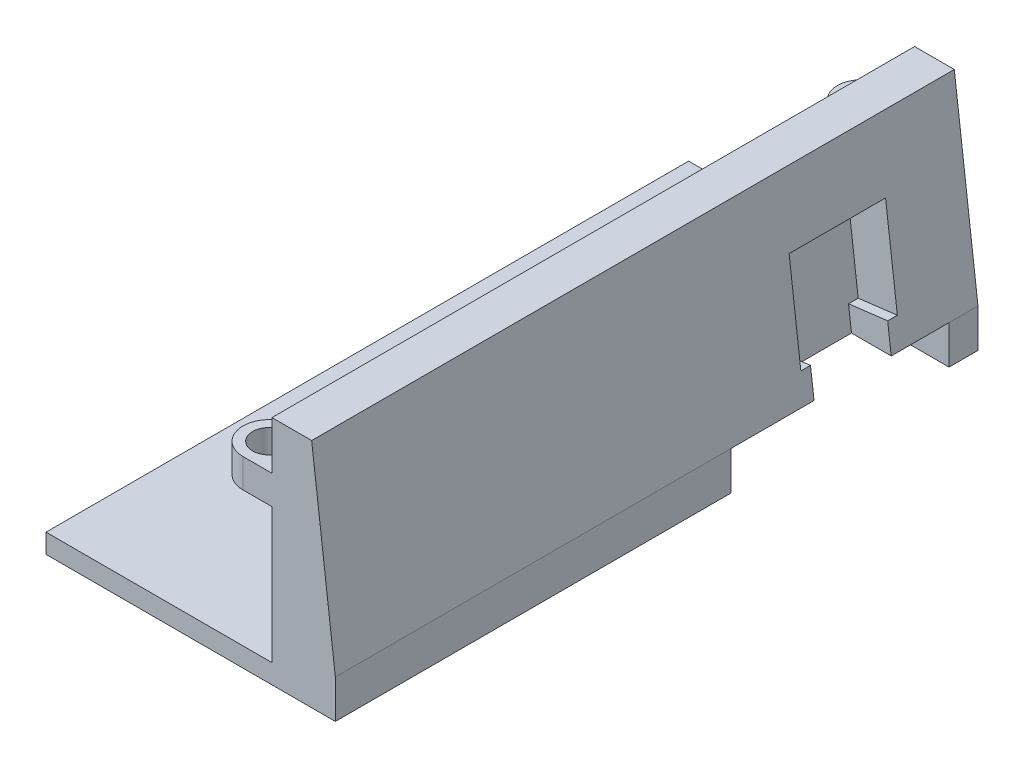
ISO-10303-21;
HEADER;
FILE_DESCRIPTION(('STEP AP214'),'2;1');
FILE_NAME('part.step','',(''),(''),'','','');
FILE_SCHEMA(('AUTOMOTIVE_DESIGN { 1 0 10303 214 1 1 1 1 }'));
ENDSEC;
DATA;
#1=APPLICATION_CONTEXT('core data for automotive mechanical design processes');
#2=APPLICATION_PROTOCOL_DEFINITION('international standard','automotive_design',2000,#1);
#3=PRODUCT_CONTEXT('',#1,'mechanical');
#4=PRODUCT('Part','Part','',(#3));
#5=PRODUCT_RELATED_PRODUCT_CATEGORY('part','',(#4));
#6=PRODUCT_DEFINITION_FORMATION('','',#4);
#7=PRODUCT_DEFINITION_CONTEXT('part definition',#1,'design');
#8=PRODUCT_DEFINITION('design','',#6,#7);
#9=PRODUCT_DEFINITION_SHAPE('','',#8);
#10=(LENGTH_UNIT() NAMED_UNIT(*) SI_UNIT(.MILLI.,.METRE.));
#11=(NAMED_UNIT(*) PLANE_ANGLE_UNIT() SI_UNIT($,.RADIAN.));
#12=(NAMED_UNIT(*) SI_UNIT($,.STERADIAN.) SOLID_ANGLE_UNIT());
#13=UNCERTAINTY_MEASURE_WITH_UNIT(LENGTH_MEASURE(1.E-05),#10,'distance_accuracy_value','');
#14=(GEOMETRIC_REPRESENTATION_CONTEXT(3) GLOBAL_UNCERTAINTY_ASSIGNED_CONTEXT((#13)) GLOBAL_UNIT_ASSIGNED_CONTEXT((#10,
#11,#12)) REPRESENTATION_CONTEXT('',''));
#15=CARTESIAN_POINT('',(0.,0.,0.));
#16=DIRECTION('',(0.,0.,1.));
#17=DIRECTION('',(1.,0.,0.));
#18=AXIS2_PLACEMENT_3D('',#15,#16,#17);
#19=CARTESIAN_POINT('',(0.,-12.,-2.5));
#20=DIRECTION('',(0.,1.,0.));
#21=DIRECTION('',(-1.,0.,0.));
#22=AXIS2_PLACEMENT_3D('',#19,#20,#21);
#23=PLANE('',#22);
#24=DIRECTION('',(-1.,0.,0.));
#25=VECTOR('',#24,1.);
#26=CARTESIAN_POINT('',(9.57405631451568,-12.,0.499999999999999));
#27=LINE('',#26,#25);
#28=CARTESIAN_POINT('',(9.57405631451568,-12.,0.499999999999999));
#29=VERTEX_POINT('',#28);
#30=CARTESIAN_POINT('',(3.00000000000001,-12.,0.499999999999999));
#31=VERTEX_POINT('',#30);
#32=EDGE_CURVE('E245',#29,#31,#27,.T.);
#33=ORIENTED_EDGE('',*,*,#32,.F.);
#34=DIRECTION('',(0.,0.,1.));
#35=VECTOR('',#34,1.);
#36=CARTESIAN_POINT('',(9.57405631451568,-12.,-2.5));
#37=LINE('',#36,#35);
#38=CARTESIAN_POINT('',(9.57405631451568,-12.,6.49999999999999));
#39=VERTEX_POINT('',#38);
#40=EDGE_CURVE('E412',#29,#39,#37,.T.);
#41=ORIENTED_EDGE('',*,*,#40,.T.);
#42=DIRECTION('',(-1.,0.,0.));
#43=VECTOR('',#42,1.);
#44=CARTESIAN_POINT('',(0.,-12.,6.49999999999999));
#45=LINE('',#44,#43);
#46=CARTESIAN_POINT('',(5.45569121805803,-12.,6.49999999999999));
#47=VERTEX_POINT('',#46);
#48=EDGE_CURVE('E393',#39,#47,#45,.T.);
#49=ORIENTED_EDGE('',*,*,#48,.T.);
#50=DIRECTION('',(0.,0.,-1.));
#51=VECTOR('',#50,1.);
#52=CARTESIAN_POINT('',(5.45569121805803,-12.,-2.5));
#53=LINE('',#52,#51);
#54=CARTESIAN_POINT('',(5.45569121805803,-12.,14.5));
#55=VERTEX_POINT('',#54);
#56=EDGE_CURVE('E11',#55,#47,#53,.T.);
#57=ORIENTED_EDGE('',*,*,#56,.F.);
#58=DIRECTION('',(-1.,0.,0.));
#59=VECTOR('',#58,1.);
#60=CARTESIAN_POINT('',(0.,-12.,14.5));
#61=LINE('',#60,#59);
#62=CARTESIAN_POINT('',(9.57405631451568,-12.,14.5));
#63=VERTEX_POINT('',#62);
#64=EDGE_CURVE('E397',#63,#55,#61,.T.);
#65=ORIENTED_EDGE('',*,*,#64,.F.);
#66=CARTESIAN_POINT('',(9.57405631451568,-12.,23.13));
#67=VERTEX_POINT('',#66);
#68=EDGE_CURVE('E404',#63,#67,#37,.T.);
#69=ORIENTED_EDGE('',*,*,#68,.T.);
#70=DIRECTION('',(1.,0.,0.));
#71=VECTOR('',#70,1.);
#72=CARTESIAN_POINT('',(9.57405631451568,-12.,23.13));
#73=LINE('',#72,#71);
#74=CARTESIAN_POINT('',(3.00000000000001,-12.,23.13));
#75=VERTEX_POINT('',#74);
#76=EDGE_CURVE('E333',#75,#67,#73,.T.);
#77=ORIENTED_EDGE('',*,*,#76,.F.);
#78=DIRECTION('',(0.,0.,1.));
#79=VECTOR('',#78,1.);
#80=CARTESIAN_POINT('',(3.00000000000001,-12.,-2.5));
#81=LINE('',#80,#79);
#82=EDGE_CURVE('E57',#31,#75,#81,.T.);
#83=ORIENTED_EDGE('',*,*,#82,.F.);
#84=EDGE_LOOP('',(#33,#41,#49,#57,#65,#69,#77,#83));
#85=FACE_BOUND('',#84,.T.);
#86=ADVANCED_FACE('F41',(#85),#23,.F.);
#87=CARTESIAN_POINT('',(7.98032974621002,0.979861283748758,-2.5));
#88=DIRECTION('',(-0.992546151641322,-0.121869343405144,0.));
#89=DIRECTION('',(0.121869343405144,-0.992546151641323,0.));
#90=AXIS2_PLACEMENT_3D('',#87,#88,#89);
#91=PLANE('',#90);
#92=DIRECTION('',(0.121869343405144,-0.992546151641323,0.));
#93=VECTOR('',#92,1.);
#94=CARTESIAN_POINT('',(7.98032974621002,0.979861283748758,14.5));
#95=LINE('',#94,#93);
#96=CARTESIAN_POINT('',(9.20844828430025,-9.02236154507603,14.5));
#97=VERTEX_POINT('',#96);
#98=EDGE_CURVE('E50',#97,#63,#95,.T.);
#99=ORIENTED_EDGE('',*,*,#98,.F.);
#100=DIRECTION('',(0.,0.,1.));
#101=VECTOR('',#100,1.);
#102=CARTESIAN_POINT('',(9.20844828430025,-9.02236154507603,-2.5));
#103=LINE('',#102,#101);
#104=CARTESIAN_POINT('',(9.20844828430025,-9.02236154507603,15.5));
#105=VERTEX_POINT('',#104);
#106=EDGE_CURVE('E548',#97,#105,#103,.T.);
#107=ORIENTED_EDGE('',*,*,#106,.T.);
#108=DIRECTION('',(0.121869343405144,-0.992546151641323,0.));
#109=VECTOR('',#108,1.);
#110=CARTESIAN_POINT('',(7.98032974621002,0.979861283748758,15.5));
#111=LINE('',#110,#109);
#112=CARTESIAN_POINT('',(7.98975485024881,0.903099971337193,15.5));
#113=VERTEX_POINT('',#112);
#114=EDGE_CURVE('E530',#113,#105,#111,.T.);
#115=ORIENTED_EDGE('',*,*,#114,.F.);
#116=DIRECTION('',(0.,0.,1.));
#117=VECTOR('',#116,1.);
#118=CARTESIAN_POINT('',(7.98975485024881,0.903099971337191,-2.5));
#119=LINE('',#118,#117);
#120=CARTESIAN_POINT('',(7.98975485024881,0.903099971337192,5.5));
#121=VERTEX_POINT('',#120);
#122=EDGE_CURVE('E533',#121,#113,#119,.T.);
#123=ORIENTED_EDGE('',*,*,#122,.F.);
#124=DIRECTION('',(0.121869343405144,-0.992546151641323,0.));
#125=VECTOR('',#124,1.);
#126=CARTESIAN_POINT('',(7.98032974621002,0.97986128374875,5.5));
#127=LINE('',#126,#125);
#128=CARTESIAN_POINT('',(9.20844828430025,-9.02236154507603,5.49999999999999));
#129=VERTEX_POINT('',#128);
#130=EDGE_CURVE('E536',#121,#129,#127,.T.);
#131=ORIENTED_EDGE('',*,*,#130,.T.);
#132=DIRECTION('',(0.,0.,1.));
#133=VECTOR('',#132,1.);
#134=CARTESIAN_POINT('',(9.20844828430025,-9.02236154507603,-2.5));
#135=LINE('',#134,#133);
#136=CARTESIAN_POINT('',(9.20844828430025,-9.02236154507603,6.49999999999999));
#137=VERTEX_POINT('',#136);
#138=EDGE_CURVE('E540',#129,#137,#135,.T.);
#139=ORIENTED_EDGE('',*,*,#138,.T.);
#140=DIRECTION('',(0.121869343405144,-0.992546151641323,0.));
#141=VECTOR('',#140,1.);
#142=CARTESIAN_POINT('',(7.98032974621002,0.979861283748757,6.49999999999999));
#143=LINE('',#142,#141);
#144=EDGE_CURVE('E544',#137,#39,#143,.T.);
#145=ORIENTED_EDGE('',*,*,#144,.T.);
#146=ORIENTED_EDGE('',*,*,#40,.F.);
#147=CARTESIAN_POINT('',(9.57405631451568,-12.,-2.5));
#148=VERTEX_POINT('',#147);
#149=EDGE_CURVE('E407',#148,#29,#37,.T.);
#150=ORIENTED_EDGE('',*,*,#149,.F.);
#151=DIRECTION('',(0.121869343405144,-0.992546151641322,0.));
#152=VECTOR('',#151,1.);
#153=CARTESIAN_POINT('',(7.98032974621002,0.979861283748758,-2.5));
#154=LINE('',#153,#152);
#155=CARTESIAN_POINT('',(7.11836509645766,8.,-2.5));
#156=VERTEX_POINT('',#155);
#157=EDGE_CURVE('E401',#156,#148,#154,.T.);
#158=ORIENTED_EDGE('',*,*,#157,.F.);
#159=DIRECTION('',(0.,0.,1.));
#160=VECTOR('',#159,1.);
#161=CARTESIAN_POINT('',(7.11836509645766,8.,-2.5));
#162=LINE('',#161,#160);
#163=CARTESIAN_POINT('',(7.11836509645766,8.,64.13));
#164=VERTEX_POINT('',#163);
#165=EDGE_CURVE('E430',#156,#164,#162,.T.);
#166=ORIENTED_EDGE('',*,*,#165,.T.);
#167=DIRECTION('',(0.121869343405144,-0.992546151641322,0.));
#168=VECTOR('',#167,1.);
#169=CARTESIAN_POINT('',(7.98032974621002,0.979861283748758,64.13));
#170=LINE('',#169,#168);
#171=CARTESIAN_POINT('',(9.57405631451568,-12.,64.13));
#172=VERTEX_POINT('',#171);
#173=EDGE_CURVE('E400',#164,#172,#170,.T.);
#174=ORIENTED_EDGE('',*,*,#173,.T.);
#175=DIRECTION('',(0.,0.,1.));
#176=VECTOR('',#175,1.);
#177=CARTESIAN_POINT('',(9.57405631451568,-12.,64.13));
#178=LINE('',#177,#176);
#179=EDGE_CURVE('E327',#67,#172,#178,.T.);
#180=ORIENTED_EDGE('',*,*,#179,.F.);
#181=ORIENTED_EDGE('',*,*,#68,.F.);
#182=EDGE_LOOP('',(#99,#107,#115,#123,#131,#139,#145,#146,#150,#158,#166,#174,#180,#181));
#183=FACE_BOUND('',#182,.T.);
#184=ADVANCED_FACE('F564',(#183),#91,.F.);
#185=CARTESIAN_POINT('',(0.,3.,58.63));
#186=DIRECTION('',(0.,0.,-1.));
#187=DIRECTION('',(-1.,0.,0.));
#188=AXIS2_PLACEMENT_3D('',#185,#186,#187);
#189=PLANE('',#188);
#190=DIRECTION('',(1.,0.,0.));
#191=VECTOR('',#190,1.);
#192=CARTESIAN_POINT('',(0.,3.,58.63));
#193=LINE('',#192,#191);
#194=CARTESIAN_POINT('',(0.,3.,58.63));
#195=VERTEX_POINT('',#194);
#196=CARTESIAN_POINT('',(3.00000000000001,3.,58.63));
#197=VERTEX_POINT('',#196);
#198=EDGE_CURVE('E459',#195,#197,#193,.T.);
#199=ORIENTED_EDGE('',*,*,#198,.T.);
#200=DIRECTION('',(0.,-1.,0.));
#201=VECTOR('',#200,1.);
#202=CARTESIAN_POINT('',(3.00000000000001,3.,58.63));
#203=LINE('',#202,#201);
#204=CARTESIAN_POINT('',(3.00000000000001,0.,58.63));
#205=VERTEX_POINT('',#204);
#206=EDGE_CURVE('E445',#197,#205,#203,.T.);
#207=ORIENTED_EDGE('',*,*,#206,.T.);
#208=DIRECTION('',(1.,0.,0.));
#209=VECTOR('',#208,1.);
#210=CARTESIAN_POINT('',(0.,0.,58.63));
#211=LINE('',#210,#209);
#212=CARTESIAN_POINT('',(0.,0.,58.63));
#213=VERTEX_POINT('',#212);
#214=EDGE_CURVE('E491',#213,#205,#211,.T.);
#215=ORIENTED_EDGE('',*,*,#214,.F.);
#216=DIRECTION('',(0.,-1.,0.));
#217=VECTOR('',#216,1.);
#218=CARTESIAN_POINT('',(0.,3.,58.63));
#219=LINE('',#218,#217);
#220=EDGE_CURVE('E518',#195,#213,#219,.T.);
#221=ORIENTED_EDGE('',*,*,#220,.F.);
#222=EDGE_LOOP('',(#199,#207,#215,#221));
#223=FACE_BOUND('',#222,.T.);
#224=ADVANCED_FACE('F614',(#223),#189,.T.);
#225=CARTESIAN_POINT('',(0.,3.,0.));
#226=DIRECTION('',(0.,1.,0.));
#227=DIRECTION('',(0.,0.,1.));
#228=AXIS2_PLACEMENT_3D('',#225,#226,#227);
#229=PLANE('',#228);
#230=CARTESIAN_POINT('',(0.,3.,61.38));
#231=DIRECTION('',(0.,1.,0.));
#232=DIRECTION('',(0.,0.,1.));
#233=AXIS2_PLACEMENT_3D('',#230,#231,#232);
#234=CIRCLE('',#233,1.75);
#235=CARTESIAN_POINT('',(0.,3.,63.13));
#236=VERTEX_POINT('',#235);
#237=EDGE_CURVE('E474',#236,#236,#234,.T.);
#238=ORIENTED_EDGE('',*,*,#237,.F.);
#239=EDGE_LOOP('',(#238));
#240=FACE_BOUND('',#239,.T.);
#241=DIRECTION('',(1.,0.,0.));
#242=VECTOR('',#241,1.);
#243=CARTESIAN_POINT('',(0.,3.,64.13));
#244=LINE('',#243,#242);
#245=CARTESIAN_POINT('',(0.,3.,64.13));
#246=VERTEX_POINT('',#245);
#247=CARTESIAN_POINT('',(3.00000000000001,3.,64.13));
#248=VERTEX_POINT('',#247);
#249=EDGE_CURVE('E466',#246,#248,#244,.T.);
#250=ORIENTED_EDGE('',*,*,#249,.T.);
#251=DIRECTION('',(0.,0.,-1.));
#252=VECTOR('',#251,1.);
#253=CARTESIAN_POINT('',(3.00000000000001,3.,0.));
#254=LINE('',#253,#252);
#255=EDGE_CURVE('E446',#248,#197,#254,.T.);
#256=ORIENTED_EDGE('',*,*,#255,.T.);
#257=ORIENTED_EDGE('',*,*,#198,.F.);
#258=CARTESIAN_POINT('',(0.,3.,61.38));
#259=DIRECTION('',(0.,1.,0.));
#260=DIRECTION('',(0.,0.,1.));
#261=AXIS2_PLACEMENT_3D('',#258,#259,#260);
#262=CIRCLE('',#261,2.75);
#263=EDGE_CURVE('E463',#195,#246,#262,.T.);
#264=ORIENTED_EDGE('',*,*,#263,.T.);
#265=EDGE_LOOP('',(#250,#256,#257,#264));
#266=FACE_BOUND('',#265,.T.);
#267=ADVANCED_FACE('F626',(#240,#266),#229,.T.);
#268=CARTESIAN_POINT('',(0.,0.,0.));
#269=DIRECTION('',(0.,1.,0.));
#270=DIRECTION('',(0.,0.,1.));
#271=AXIS2_PLACEMENT_3D('',#268,#269,#270);
#272=PLANE('',#271);
#273=CARTESIAN_POINT('',(0.,0.,61.38));
#274=DIRECTION('',(0.,1.,0.));
#275=DIRECTION('',(0.,0.,1.));
#276=AXIS2_PLACEMENT_3D('',#273,#274,#275);
#277=CIRCLE('',#276,1.75);
#278=CARTESIAN_POINT('',(0.,0.,63.13));
#279=VERTEX_POINT('',#278);
#280=EDGE_CURVE('E505',#279,#279,#277,.T.);
#281=ORIENTED_EDGE('',*,*,#280,.T.);
#282=EDGE_LOOP('',(#281));
#283=FACE_BOUND('',#282,.T.);
#284=DIRECTION('',(0.,0.,-1.));
#285=VECTOR('',#284,1.);
#286=CARTESIAN_POINT('',(3.00000000000001,0.,0.));
#287=LINE('',#286,#285);
#288=CARTESIAN_POINT('',(3.00000000000001,0.,64.13));
#289=VERTEX_POINT('',#288);
#290=EDGE_CURVE('E529',#289,#205,#287,.T.);
#291=ORIENTED_EDGE('',*,*,#290,.F.);
#292=DIRECTION('',(1.,0.,0.));
#293=VECTOR('',#292,1.);
#294=CARTESIAN_POINT('',(0.,0.,64.13));
#295=LINE('',#294,#293);
#296=CARTESIAN_POINT('',(0.,0.,64.13));
#297=VERTEX_POINT('',#296);
#298=EDGE_CURVE('E498',#297,#289,#295,.T.);
#299=ORIENTED_EDGE('',*,*,#298,.F.);
#300=CARTESIAN_POINT('',(0.,0.,61.38));
#301=DIRECTION('',(0.,1.,0.));
#302=DIRECTION('',(0.,0.,1.));
#303=AXIS2_PLACEMENT_3D('',#300,#301,#302);
#304=CIRCLE('',#303,2.75);
#305=EDGE_CURVE('E495',#213,#297,#304,.T.);
#306=ORIENTED_EDGE('',*,*,#305,.F.);
#307=ORIENTED_EDGE('',*,*,#214,.T.);
#308=EDGE_LOOP('',(#291,#299,#306,#307));
#309=FACE_BOUND('',#308,.T.);
#310=ADVANCED_FACE('F629',(#283,#309),#272,.F.);
#311=CARTESIAN_POINT('',(0.,3.,61.38));
#312=DIRECTION('',(0.,-1.,0.));
#313=DIRECTION('',(0.,0.,-1.));
#314=AXIS2_PLACEMENT_3D('',#311,#312,#313);
#315=CYLINDRICAL_SURFACE('',#314,2.75);
#316=ORIENTED_EDGE('',*,*,#305,.T.);
#317=DIRECTION('',(0.,-1.,0.));
#318=VECTOR('',#317,1.);
#319=CARTESIAN_POINT('',(0.,3.,64.13));
#320=LINE('',#319,#318);
#321=EDGE_CURVE('E514',#246,#297,#320,.T.);
#322=ORIENTED_EDGE('',*,*,#321,.F.);
#323=ORIENTED_EDGE('',*,*,#263,.F.);
#324=ORIENTED_EDGE('',*,*,#220,.T.);
#325=EDGE_LOOP('',(#316,#322,#323,#324));
#326=FACE_BOUND('',#325,.T.);
#327=ADVANCED_FACE('F634',(#326),#315,.T.);
#328=CARTESIAN_POINT('',(0.,3.,64.13));
#329=DIRECTION('',(0.,0.,-1.));
#330=DIRECTION('',(-1.,0.,0.));
#331=AXIS2_PLACEMENT_3D('',#328,#329,#330);
#332=PLANE('',#331);
#333=DIRECTION('',(0.,1.,0.));
#334=VECTOR('',#333,1.);
#335=CARTESIAN_POINT('',(3.00000000000001,0.,64.13));
#336=LINE('',#335,#334);
#337=CARTESIAN_POINT('',(3.00000000000001,-14.,64.13));
#338=VERTEX_POINT('',#337);
#339=EDGE_CURVE('E418',#338,#289,#336,.T.);
#340=ORIENTED_EDGE('',*,*,#339,.F.);
#341=DIRECTION('',(-1.,0.,0.));
#342=VECTOR('',#341,1.);
#343=CARTESIAN_POINT('',(0.,-14.,64.13));
#344=LINE('',#343,#342);
#345=CARTESIAN_POINT('',(-20.4259436854843,-14.,64.13));
#346=VERTEX_POINT('',#345);
#347=EDGE_CURVE('E258',#338,#346,#344,.T.);
#348=ORIENTED_EDGE('',*,*,#347,.T.);
#349=DIRECTION('',(0.,1.,0.));
#350=VECTOR('',#349,1.);
#351=CARTESIAN_POINT('',(-20.4259436854843,-16.,64.13));
#352=LINE('',#351,#350);
#353=CARTESIAN_POINT('',(-20.4259436854843,-16.,64.13));
#354=VERTEX_POINT('',#353);
#355=EDGE_CURVE('E286',#354,#346,#352,.T.);
#356=ORIENTED_EDGE('',*,*,#355,.F.);
#357=DIRECTION('',(-1.,0.,0.));
#358=VECTOR('',#357,1.);
#359=CARTESIAN_POINT('',(0.,-16.,64.13));
#360=LINE('',#359,#358);
#361=CARTESIAN_POINT('',(9.57405631451568,-16.,64.13));
#362=VERTEX_POINT('',#361);
#363=EDGE_CURVE('E255',#362,#354,#360,.T.);
#364=ORIENTED_EDGE('',*,*,#363,.F.);
#365=DIRECTION('',(0.,1.,0.));
#366=VECTOR('',#365,1.);
#367=CARTESIAN_POINT('',(9.57405631451568,-14.,64.13));
#368=LINE('',#367,#366);
#369=EDGE_CURVE('E347',#362,#172,#368,.T.);
#370=ORIENTED_EDGE('',*,*,#369,.T.);
#371=ORIENTED_EDGE('',*,*,#173,.F.);
#372=DIRECTION('',(1.,0.,0.));
#373=VECTOR('',#372,1.);
#374=CARTESIAN_POINT('',(0.,8.,64.13));
#375=LINE('',#374,#373);
#376=CARTESIAN_POINT('',(3.00000000000001,8.,64.13));
#377=VERTEX_POINT('',#376);
#378=EDGE_CURVE('E411',#377,#164,#375,.T.);
#379=ORIENTED_EDGE('',*,*,#378,.F.);
#380=EDGE_CURVE('E427',#248,#377,#336,.T.);
#381=ORIENTED_EDGE('',*,*,#380,.F.);
#382=ORIENTED_EDGE('',*,*,#249,.F.);
#383=ORIENTED_EDGE('',*,*,#321,.T.);
#384=ORIENTED_EDGE('',*,*,#298,.T.);
#385=EDGE_LOOP('',(#340,#348,#356,#364,#370,#371,#379,#381,#382,#383,#384));
#386=FACE_BOUND('',#385,.T.);
#387=ADVANCED_FACE('F643',(#386),#332,.F.);
#388=CARTESIAN_POINT('',(0.,3.,61.38));
#389=DIRECTION('',(0.,-1.,0.));
#390=DIRECTION('',(0.,0.,-1.));
#391=AXIS2_PLACEMENT_3D('',#388,#389,#390);
#392=CYLINDRICAL_SURFACE('',#391,1.75);
#393=ORIENTED_EDGE('',*,*,#237,.T.);
#394=EDGE_LOOP('',(#393));
#395=FACE_BOUND('',#394,.T.);
#396=ORIENTED_EDGE('',*,*,#280,.F.);
#397=EDGE_LOOP('',(#396));
#398=FACE_BOUND('',#397,.T.);
#399=ADVANCED_FACE('F624',(#395,#398),#392,.F.);
#400=CARTESIAN_POINT('',(0.,8.,-2.5));
#401=DIRECTION('',(0.,-1.,0.));
#402=DIRECTION('',(0.,0.,-1.));
#403=AXIS2_PLACEMENT_3D('',#400,#401,#402);
#404=PLANE('',#403);
#405=ORIENTED_EDGE('',*,*,#378,.T.);
#406=ORIENTED_EDGE('',*,*,#165,.F.);
#407=DIRECTION('',(1.,0.,0.));
#408=VECTOR('',#407,1.);
#409=CARTESIAN_POINT('',(0.,8.,-2.5));
#410=LINE('',#409,#408);
#411=CARTESIAN_POINT('',(3.00000000000001,8.,-2.5));
#412=VERTEX_POINT('',#411);
#413=EDGE_CURVE('E413',#412,#156,#410,.T.);
#414=ORIENTED_EDGE('',*,*,#413,.F.);
#415=DIRECTION('',(0.,0.,1.));
#416=VECTOR('',#415,1.);
#417=CARTESIAN_POINT('',(3.00000000000001,8.,-2.5));
#418=LINE('',#417,#416);
#419=EDGE_CURVE('E423',#412,#377,#418,.T.);
#420=ORIENTED_EDGE('',*,*,#419,.T.);
#421=EDGE_LOOP('',(#405,#406,#414,#420));
#422=FACE_BOUND('',#421,.T.);
#423=ADVANCED_FACE('F621',(#422),#404,.F.);
#424=CARTESIAN_POINT('',(3.00000000000001,0.,-2.5));
#425=DIRECTION('',(1.,0.,0.));
#426=DIRECTION('',(0.,0.,-1.));
#427=AXIS2_PLACEMENT_3D('',#424,#425,#426);
#428=PLANE('',#427);
#429=ORIENTED_EDGE('',*,*,#255,.F.);
#430=ORIENTED_EDGE('',*,*,#380,.T.);
#431=ORIENTED_EDGE('',*,*,#419,.F.);
#432=DIRECTION('',(0.,1.,0.));
#433=VECTOR('',#432,1.);
#434=CARTESIAN_POINT('',(3.00000000000001,0.,-2.5));
#435=LINE('',#434,#433);
#436=CARTESIAN_POINT('',(3.00000000000001,3.,-2.5));
#437=VERTEX_POINT('',#436);
#438=EDGE_CURVE('E417',#437,#412,#435,.T.);
#439=ORIENTED_EDGE('',*,*,#438,.F.);
#440=CARTESIAN_POINT('',(3.00000000000001,3.,2.5));
#441=VERTEX_POINT('',#440);
#442=EDGE_CURVE('E442',#441,#437,#254,.T.);
#443=ORIENTED_EDGE('',*,*,#442,.F.);
#444=DIRECTION('',(0.,-1.,0.));
#445=VECTOR('',#444,1.);
#446=CARTESIAN_POINT('',(3.00000000000001,3.,2.5));
#447=LINE('',#446,#445);
#448=CARTESIAN_POINT('',(3.00000000000001,0.,2.5));
#449=VERTEX_POINT('',#448);
#450=EDGE_CURVE('E433',#441,#449,#447,.T.);
#451=ORIENTED_EDGE('',*,*,#450,.T.);
#452=CARTESIAN_POINT('',(3.00000000000001,0.,-2.5));
#453=VERTEX_POINT('',#452);
#454=EDGE_CURVE('E525',#449,#453,#287,.T.);
#455=ORIENTED_EDGE('',*,*,#454,.T.);
#456=CARTESIAN_POINT('',(3.00000000000001,-14.,-2.5));
#457=VERTEX_POINT('',#456);
#458=EDGE_CURVE('E419',#457,#453,#435,.T.);
#459=ORIENTED_EDGE('',*,*,#458,.F.);
#460=DIRECTION('',(0.,0.,-1.));
#461=VECTOR('',#460,1.);
#462=CARTESIAN_POINT('',(3.00000000000001,-14.,-2.5));
#463=LINE('',#462,#461);
#464=CARTESIAN_POINT('',(3.00000000000001,-14.,0.499999999999999));
#465=VERTEX_POINT('',#464);
#466=EDGE_CURVE('E313',#465,#457,#463,.T.);
#467=ORIENTED_EDGE('',*,*,#466,.F.);
#468=DIRECTION('',(0.,1.,0.));
#469=VECTOR('',#468,1.);
#470=CARTESIAN_POINT('',(3.00000000000001,-14.,0.499999999999999));
#471=LINE('',#470,#469);
#472=EDGE_CURVE('E321',#465,#31,#471,.T.);
#473=ORIENTED_EDGE('',*,*,#472,.T.);
#474=ORIENTED_EDGE('',*,*,#82,.T.);
#475=DIRECTION('',(0.,1.,0.));
#476=VECTOR('',#475,1.);
#477=CARTESIAN_POINT('',(3.00000000000001,-14.,23.13));
#478=LINE('',#477,#476);
#479=CARTESIAN_POINT('',(3.00000000000001,-14.,23.13));
#480=VERTEX_POINT('',#479);
#481=EDGE_CURVE('E343',#480,#75,#478,.T.);
#482=ORIENTED_EDGE('',*,*,#481,.F.);
#483=DIRECTION('',(0.,0.,-1.));
#484=VECTOR('',#483,1.);
#485=CARTESIAN_POINT('',(3.00000000000001,-14.,64.13));
#486=LINE('',#485,#484);
#487=EDGE_CURVE('E328',#338,#480,#486,.T.);
#488=ORIENTED_EDGE('',*,*,#487,.F.);
#489=ORIENTED_EDGE('',*,*,#339,.T.);
#490=ORIENTED_EDGE('',*,*,#290,.T.);
#491=ORIENTED_EDGE('',*,*,#206,.F.);
#492=EDGE_LOOP('',(#429,#430,#431,#439,#443,#451,#455,#459,#467,#473,#474,#482,#488,#489,#490,#491));
#493=FACE_BOUND('',#492,.T.);
#494=ADVANCED_FACE('F618',(#493),#428,.F.);
#495=CARTESIAN_POINT('',(0.,3.,0.));
#496=DIRECTION('',(0.,-1.,0.));
#497=DIRECTION('',(0.,0.,-1.));
#498=AXIS2_PLACEMENT_3D('',#495,#496,#497);
#499=CYLINDRICAL_SURFACE('',#498,2.5);
#500=CARTESIAN_POINT('',(0.,0.,0.));
#501=DIRECTION('',(0.,1.,0.));
#502=DIRECTION('',(0.,0.,1.));
#503=AXIS2_PLACEMENT_3D('',#500,#501,#502);
#504=CIRCLE('',#503,2.5);
#505=CARTESIAN_POINT('',(0.,0.,-2.5));
#506=VERTEX_POINT('',#505);
#507=CARTESIAN_POINT('',(0.,0.,2.5));
#508=VERTEX_POINT('',#507);
#509=EDGE_CURVE('E483',#506,#508,#504,.T.);
#510=ORIENTED_EDGE('',*,*,#509,.T.);
#511=DIRECTION('',(0.,-1.,0.));
#512=VECTOR('',#511,1.);
#513=CARTESIAN_POINT('',(0.,3.,2.5));
#514=LINE('',#513,#512);
#515=CARTESIAN_POINT('',(0.,3.,2.5));
#516=VERTEX_POINT('',#515);
#517=EDGE_CURVE('E521',#516,#508,#514,.T.);
#518=ORIENTED_EDGE('',*,*,#517,.F.);
#519=CARTESIAN_POINT('',(0.,3.,0.));
#520=DIRECTION('',(0.,1.,0.));
#521=DIRECTION('',(0.,0.,1.));
#522=AXIS2_PLACEMENT_3D('',#519,#520,#521);
#523=CIRCLE('',#522,2.5);
#524=CARTESIAN_POINT('',(0.,3.,-2.5));
#525=VERTEX_POINT('',#524);
#526=EDGE_CURVE('E450',#525,#516,#523,.T.);
#527=ORIENTED_EDGE('',*,*,#526,.F.);
#528=DIRECTION('',(0.,-1.,0.));
#529=VECTOR('',#528,1.);
#530=CARTESIAN_POINT('',(0.,3.,-2.5));
#531=LINE('',#530,#529);
#532=EDGE_CURVE('E482',#525,#506,#531,.T.);
#533=ORIENTED_EDGE('',*,*,#532,.T.);
#534=EDGE_LOOP('',(#510,#518,#527,#533));
#535=FACE_BOUND('',#534,.T.);
#536=ADVANCED_FACE('F43',(#535),#499,.T.);
#537=CARTESIAN_POINT('',(0.,3.,0.));
#538=DIRECTION('',(0.,-1.,0.));
#539=DIRECTION('',(0.,0.,-1.));
#540=AXIS2_PLACEMENT_3D('',#537,#538,#539);
#541=CYLINDRICAL_SURFACE('',#540,1.75);
#542=CARTESIAN_POINT('',(0.,3.,0.));
#543=DIRECTION('',(0.,1.,0.));
#544=DIRECTION('',(0.,0.,1.));
#545=AXIS2_PLACEMENT_3D('',#542,#543,#544);
#546=CIRCLE('',#545,1.75);
#547=CARTESIAN_POINT('',(0.,3.,1.75));
#548=VERTEX_POINT('',#547);
#549=EDGE_CURVE('E478',#548,#548,#546,.T.);
#550=ORIENTED_EDGE('',*,*,#549,.T.);
#551=EDGE_LOOP('',(#550));
#552=FACE_BOUND('',#551,.T.);
#553=CARTESIAN_POINT('',(0.,0.,0.));
#554=DIRECTION('',(0.,1.,0.));
#555=DIRECTION('',(0.,0.,1.));
#556=AXIS2_PLACEMENT_3D('',#553,#554,#555);
#557=CIRCLE('',#556,1.75);
#558=CARTESIAN_POINT('',(0.,0.,1.75));
#559=VERTEX_POINT('',#558);
#560=EDGE_CURVE('E455',#559,#559,#557,.T.);
#561=ORIENTED_EDGE('',*,*,#560,.F.);
#562=EDGE_LOOP('',(#561));
#563=FACE_BOUND('',#562,.T.);
#564=ADVANCED_FACE('F637',(#552,#563),#541,.F.);
#565=ORIENTED_EDGE('',*,*,#560,.T.);
#566=EDGE_LOOP('',(#565));
#567=FACE_BOUND('',#566,.T.);
#568=ORIENTED_EDGE('',*,*,#454,.F.);
#569=DIRECTION('',(1.,0.,0.));
#570=VECTOR('',#569,1.);
#571=CARTESIAN_POINT('',(0.,0.,2.5));
#572=LINE('',#571,#570);
#573=EDGE_CURVE('E487',#508,#449,#572,.T.);
#574=ORIENTED_EDGE('',*,*,#573,.F.);
#575=ORIENTED_EDGE('',*,*,#509,.F.);
#576=DIRECTION('',(1.,0.,0.));
#577=VECTOR('',#576,1.);
#578=CARTESIAN_POINT('',(0.,0.,-2.5));
#579=LINE('',#578,#577);
#580=EDGE_CURVE('E502',#506,#453,#579,.T.);
#581=ORIENTED_EDGE('',*,*,#580,.T.);
#582=EDGE_LOOP('',(#568,#574,#575,#581));
#583=FACE_BOUND('',#582,.T.);
#584=ADVANCED_FACE('F636',(#567,#583),#272,.F.);
#585=ORIENTED_EDGE('',*,*,#549,.F.);
#586=EDGE_LOOP('',(#585));
#587=FACE_BOUND('',#586,.T.);
#588=DIRECTION('',(1.,0.,0.));
#589=VECTOR('',#588,1.);
#590=CARTESIAN_POINT('',(0.,3.,2.5));
#591=LINE('',#590,#589);
#592=EDGE_CURVE('E454',#516,#441,#591,.T.);
#593=ORIENTED_EDGE('',*,*,#592,.T.);
#594=ORIENTED_EDGE('',*,*,#442,.T.);
#595=DIRECTION('',(1.,0.,0.));
#596=VECTOR('',#595,1.);
#597=CARTESIAN_POINT('',(0.,3.,-2.5));
#598=LINE('',#597,#596);
#599=EDGE_CURVE('E470',#525,#437,#598,.T.);
#600=ORIENTED_EDGE('',*,*,#599,.F.);
#601=ORIENTED_EDGE('',*,*,#526,.T.);
#602=EDGE_LOOP('',(#593,#594,#600,#601));
#603=FACE_BOUND('',#602,.T.);
#604=ADVANCED_FACE('F631',(#587,#603),#229,.T.);
#605=CARTESIAN_POINT('',(0.,3.,2.5));
#606=DIRECTION('',(0.,0.,-1.));
#607=DIRECTION('',(-1.,0.,0.));
#608=AXIS2_PLACEMENT_3D('',#605,#606,#607);
#609=PLANE('',#608);
#610=ORIENTED_EDGE('',*,*,#450,.F.);
#611=ORIENTED_EDGE('',*,*,#592,.F.);
#612=ORIENTED_EDGE('',*,*,#517,.T.);
#613=ORIENTED_EDGE('',*,*,#573,.T.);
#614=EDGE_LOOP('',(#610,#611,#612,#613));
#615=FACE_BOUND('',#614,.T.);
#616=ADVANCED_FACE('F647',(#615),#609,.F.);
#617=CARTESIAN_POINT('',(0.,3.,-2.5));
#618=DIRECTION('',(0.,0.,-1.));
#619=DIRECTION('',(-1.,0.,0.));
#620=AXIS2_PLACEMENT_3D('',#617,#618,#619);
#621=PLANE('',#620);
#622=ORIENTED_EDGE('',*,*,#157,.T.);
#623=DIRECTION('',(0.,1.,0.));
#624=VECTOR('',#623,1.);
#625=CARTESIAN_POINT('',(9.57405631451568,-14.,-2.5));
#626=LINE('',#625,#624);
#627=CARTESIAN_POINT('',(9.57405631451568,-16.,-2.5));
#628=VERTEX_POINT('',#627);
#629=EDGE_CURVE('E262',#628,#148,#626,.T.);
#630=ORIENTED_EDGE('',*,*,#629,.F.);
#631=DIRECTION('',(-1.,0.,0.));
#632=VECTOR('',#631,1.);
#633=CARTESIAN_POINT('',(0.,-16.,-2.5));
#634=LINE('',#633,#632);
#635=CARTESIAN_POINT('',(-20.4259436854843,-16.,-2.5));
#636=VERTEX_POINT('',#635);
#637=EDGE_CURVE('E252',#628,#636,#634,.T.);
#638=ORIENTED_EDGE('',*,*,#637,.T.);
#639=DIRECTION('',(0.,1.,0.));
#640=VECTOR('',#639,1.);
#641=CARTESIAN_POINT('',(-20.4259436854843,-16.,-2.5));
#642=LINE('',#641,#640);
#643=CARTESIAN_POINT('',(-20.4259436854843,-14.,-2.5));
#644=VERTEX_POINT('',#643);
#645=EDGE_CURVE('E234',#636,#644,#642,.T.);
#646=ORIENTED_EDGE('',*,*,#645,.T.);
#647=DIRECTION('',(-1.,0.,0.));
#648=VECTOR('',#647,1.);
#649=CARTESIAN_POINT('',(0.,-14.,-2.5));
#650=LINE('',#649,#648);
#651=EDGE_CURVE('E289',#457,#644,#650,.T.);
#652=ORIENTED_EDGE('',*,*,#651,.F.);
#653=ORIENTED_EDGE('',*,*,#458,.T.);
#654=ORIENTED_EDGE('',*,*,#580,.F.);
#655=ORIENTED_EDGE('',*,*,#532,.F.);
#656=ORIENTED_EDGE('',*,*,#599,.T.);
#657=ORIENTED_EDGE('',*,*,#438,.T.);
#658=ORIENTED_EDGE('',*,*,#413,.T.);
#659=EDGE_LOOP('',(#622,#630,#638,#646,#652,#653,#654,#655,#656,#657,#658));
#660=FACE_BOUND('',#659,.T.);
#661=ADVANCED_FACE('F261',(#660),#621,.T.);
#662=CARTESIAN_POINT('',(3.92313117181265,0.481699938295501,0.));
#663=DIRECTION('',(0.992546151641323,0.121869343405144,0.));
#664=DIRECTION('',(-0.121869343405144,0.992546151641323,0.));
#665=AXIS2_PLACEMENT_3D('',#662,#663,#664);
#666=PLANE('',#665);
#667=ORIENTED_EDGE('',*,*,#56,.T.);
#668=DIRECTION('',(0.121869343405144,-0.992546151641323,0.));
#669=VECTOR('',#668,1.);
#670=CARTESIAN_POINT('',(3.92313117181265,0.4816999382955,6.49999999999999));
#671=LINE('',#670,#669);
#672=CARTESIAN_POINT('',(5.15124970990288,-9.52052289052929,6.49999999999999));
#673=VERTEX_POINT('',#672);
#674=EDGE_CURVE('E360',#673,#47,#671,.T.);
#675=ORIENTED_EDGE('',*,*,#674,.F.);
#676=DIRECTION('',(0.,0.,1.));
#677=VECTOR('',#676,1.);
#678=CARTESIAN_POINT('',(5.15124970990288,-9.52052289052929,0.));
#679=LINE('',#678,#677);
#680=CARTESIAN_POINT('',(5.15124970990288,-9.52052289052929,5.49999999999999));
#681=VERTEX_POINT('',#680);
#682=EDGE_CURVE('E356',#681,#673,#679,.T.);
#683=ORIENTED_EDGE('',*,*,#682,.F.);
#684=DIRECTION('',(0.121869343405144,-0.992546151641322,0.));
#685=VECTOR('',#684,1.);
#686=CARTESIAN_POINT('',(3.92313117181265,0.481699938295495,5.5));
#687=LINE('',#686,#685);
#688=CARTESIAN_POINT('',(3.93255627585144,0.404938625883934,5.5));
#689=VERTEX_POINT('',#688);
#690=EDGE_CURVE('E364',#689,#681,#687,.T.);
#691=ORIENTED_EDGE('',*,*,#690,.F.);
#692=DIRECTION('',(0.,0.,1.));
#693=VECTOR('',#692,1.);
#694=CARTESIAN_POINT('',(3.93255627585144,0.404938625883933,0.));
#695=LINE('',#694,#693);
#696=CARTESIAN_POINT('',(3.93255627585144,0.404938625883935,15.5));
#697=VERTEX_POINT('',#696);
#698=EDGE_CURVE('E368',#689,#697,#695,.T.);
#699=ORIENTED_EDGE('',*,*,#698,.T.);
#700=DIRECTION('',(0.121869343405144,-0.992546151641322,0.));
#701=VECTOR('',#700,1.);
#702=CARTESIAN_POINT('',(3.92313117181265,0.481699938295501,15.5));
#703=LINE('',#702,#701);
#704=CARTESIAN_POINT('',(5.15124970990288,-9.52052289052929,15.5));
#705=VERTEX_POINT('',#704);
#706=EDGE_CURVE('E372',#697,#705,#703,.T.);
#707=ORIENTED_EDGE('',*,*,#706,.T.);
#708=CARTESIAN_POINT('',(5.15124970990288,-9.52052289052929,14.5));
#709=VERTEX_POINT('',#708);
#710=EDGE_CURVE('E351',#709,#705,#679,.T.);
#711=ORIENTED_EDGE('',*,*,#710,.F.);
#712=DIRECTION('',(0.121869343405144,-0.992546151641323,0.));
#713=VECTOR('',#712,1.);
#714=CARTESIAN_POINT('',(3.92313117181265,0.481699938295501,14.5));
#715=LINE('',#714,#713);
#716=EDGE_CURVE('E355',#709,#55,#715,.T.);
#717=ORIENTED_EDGE('',*,*,#716,.T.);
#718=EDGE_LOOP('',(#667,#675,#683,#691,#699,#707,#711,#717));
#719=FACE_BOUND('',#718,.T.);
#720=ADVANCED_FACE('F586',(#719),#666,.T.);
#721=CARTESIAN_POINT('',(15.0767112263161,-8.30182945647785,0.));
#722=DIRECTION('',(0.121869343405144,-0.992546151641322,0.));
#723=DIRECTION('',(0.992546151641322,0.121869343405144,0.));
#724=AXIS2_PLACEMENT_3D('',#721,#722,#723);
#725=PLANE('',#724);
#726=DIRECTION('',(-0.992546151641322,-0.121869343405144,0.));
#727=VECTOR('',#726,1.);
#728=CARTESIAN_POINT('',(15.0767112263161,-8.30182945647785,14.5));
#729=LINE('',#728,#727);
#730=EDGE_CURVE('E390',#97,#709,#729,.T.);
#731=ORIENTED_EDGE('',*,*,#730,.T.);
#732=ORIENTED_EDGE('',*,*,#710,.T.);
#733=DIRECTION('',(-0.992546151641322,-0.121869343405144,0.));
#734=VECTOR('',#733,1.);
#735=CARTESIAN_POINT('',(15.0767112263161,-8.30182945647785,15.5));
#736=LINE('',#735,#734);
#737=EDGE_CURVE('E376',#105,#705,#736,.T.);
#738=ORIENTED_EDGE('',*,*,#737,.F.);
#739=ORIENTED_EDGE('',*,*,#106,.F.);
#740=EDGE_LOOP('',(#731,#732,#738,#739));
#741=FACE_BOUND('',#740,.T.);
#742=ADVANCED_FACE('F591',(#741),#725,.F.);
#743=CARTESIAN_POINT('',(13.8485926882259,1.70039337234694,14.5));
#744=DIRECTION('',(0.,0.,-1.));
#745=DIRECTION('',(-1.,0.,0.));
#746=AXIS2_PLACEMENT_3D('',#743,#744,#745);
#747=PLANE('',#746);
#748=ORIENTED_EDGE('',*,*,#64,.T.);
#749=ORIENTED_EDGE('',*,*,#716,.F.);
#750=ORIENTED_EDGE('',*,*,#730,.F.);
#751=ORIENTED_EDGE('',*,*,#98,.T.);
#752=EDGE_LOOP('',(#748,#749,#750,#751));
#753=FACE_BOUND('',#752,.T.);
#754=ADVANCED_FACE('F556',(#753),#747,.T.);
#755=CARTESIAN_POINT('',(13.8485926882259,1.70039337234694,6.49999999999999));
#756=DIRECTION('',(0.,0.,-1.));
#757=DIRECTION('',(0.,1.,0.));
#758=AXIS2_PLACEMENT_3D('',#755,#756,#757);
#759=PLANE('',#758);
#760=ORIENTED_EDGE('',*,*,#144,.F.);
#761=DIRECTION('',(-0.992546151641322,-0.121869343405144,0.));
#762=VECTOR('',#761,1.);
#763=CARTESIAN_POINT('',(15.0767112263161,-8.30182945647785,6.49999999999999));
#764=LINE('',#763,#762);
#765=EDGE_CURVE('E387',#137,#673,#764,.T.);
#766=ORIENTED_EDGE('',*,*,#765,.T.);
#767=ORIENTED_EDGE('',*,*,#674,.T.);
#768=ORIENTED_EDGE('',*,*,#48,.F.);
#769=EDGE_LOOP('',(#760,#766,#767,#768));
#770=FACE_BOUND('',#769,.T.);
#771=ADVANCED_FACE('F571',(#770),#759,.F.);
#772=DIRECTION('',(-0.992546151641322,-0.121869343405144,0.));
#773=VECTOR('',#772,1.);
#774=CARTESIAN_POINT('',(15.0767112263161,-8.30182945647785,5.49999999999999));
#775=LINE('',#774,#773);
#776=EDGE_CURVE('E384',#129,#681,#775,.T.);
#777=ORIENTED_EDGE('',*,*,#776,.T.);
#778=ORIENTED_EDGE('',*,*,#682,.T.);
#779=ORIENTED_EDGE('',*,*,#765,.F.);
#780=ORIENTED_EDGE('',*,*,#138,.F.);
#781=EDGE_LOOP('',(#777,#778,#779,#780));
#782=FACE_BOUND('',#781,.T.);
#783=ADVANCED_FACE('F577',(#782),#725,.F.);
#784=CARTESIAN_POINT('',(13.8485926882259,1.70039337234694,5.5));
#785=DIRECTION('',(0.,0.,-1.));
#786=DIRECTION('',(0.,1.,0.));
#787=AXIS2_PLACEMENT_3D('',#784,#785,#786);
#788=PLANE('',#787);
#789=DIRECTION('',(-0.992546151641322,-0.121869343405144,0.));
#790=VECTOR('',#789,1.);
#791=CARTESIAN_POINT('',(13.8580177922647,1.62363205993538,5.5));
#792=LINE('',#791,#790);
#793=EDGE_CURVE('E381',#121,#689,#792,.T.);
#794=ORIENTED_EDGE('',*,*,#793,.T.);
#795=ORIENTED_EDGE('',*,*,#690,.T.);
#796=ORIENTED_EDGE('',*,*,#776,.F.);
#797=ORIENTED_EDGE('',*,*,#130,.F.);
#798=EDGE_LOOP('',(#794,#795,#796,#797));
#799=FACE_BOUND('',#798,.T.);
#800=ADVANCED_FACE('F581',(#799),#788,.F.);
#801=CARTESIAN_POINT('',(13.8580177922647,1.62363205993538,0.));
#802=DIRECTION('',(0.121869343405144,-0.992546151641322,0.));
#803=DIRECTION('',(0.992546151641322,0.121869343405144,0.));
#804=AXIS2_PLACEMENT_3D('',#801,#802,#803);
#805=PLANE('',#804);
#806=ORIENTED_EDGE('',*,*,#122,.T.);
#807=DIRECTION('',(-0.992546151641322,-0.121869343405144,0.));
#808=VECTOR('',#807,1.);
#809=CARTESIAN_POINT('',(13.8580177922647,1.62363205993538,15.5));
#810=LINE('',#809,#808);
#811=EDGE_CURVE('E65',#113,#697,#810,.T.);
#812=ORIENTED_EDGE('',*,*,#811,.T.);
#813=ORIENTED_EDGE('',*,*,#698,.F.);
#814=ORIENTED_EDGE('',*,*,#793,.F.);
#815=EDGE_LOOP('',(#806,#812,#813,#814));
#816=FACE_BOUND('',#815,.T.);
#817=ADVANCED_FACE('F596',(#816),#805,.T.);
#818=CARTESIAN_POINT('',(13.8485926882259,1.70039337234694,15.5));
#819=DIRECTION('',(0.,0.,-1.));
#820=DIRECTION('',(-1.,0.,0.));
#821=AXIS2_PLACEMENT_3D('',#818,#819,#820);
#822=PLANE('',#821);
#823=ORIENTED_EDGE('',*,*,#114,.T.);
#824=ORIENTED_EDGE('',*,*,#737,.T.);
#825=ORIENTED_EDGE('',*,*,#706,.F.);
#826=ORIENTED_EDGE('',*,*,#811,.F.);
#827=EDGE_LOOP('',(#823,#824,#825,#826));
#828=FACE_BOUND('',#827,.T.);
#829=ADVANCED_FACE('F593',(#828),#822,.T.);
#830=CARTESIAN_POINT('',(9.57405631451568,-14.,64.13));
#831=DIRECTION('',(-1.,0.,0.));
#832=DIRECTION('',(0.,-1.,0.));
#833=AXIS2_PLACEMENT_3D('',#830,#831,#832);
#834=PLANE('',#833);
#835=ORIENTED_EDGE('',*,*,#179,.T.);
#836=ORIENTED_EDGE('',*,*,#369,.F.);
#837=DIRECTION('',(0.,0.,-1.));
#838=VECTOR('',#837,1.);
#839=CARTESIAN_POINT('',(9.57405631451568,-16.,0.));
#840=LINE('',#839,#838);
#841=CARTESIAN_POINT('',(9.57405631451568,-16.,23.13));
#842=VERTEX_POINT('',#841);
#843=EDGE_CURVE('E280',#362,#842,#840,.T.);
#844=ORIENTED_EDGE('',*,*,#843,.T.);
#845=DIRECTION('',(0.,1.,0.));
#846=VECTOR('',#845,1.);
#847=CARTESIAN_POINT('',(9.57405631451568,-14.,23.13));
#848=LINE('',#847,#846);
#849=EDGE_CURVE('E332',#842,#67,#848,.T.);
#850=ORIENTED_EDGE('',*,*,#849,.T.);
#851=EDGE_LOOP('',(#835,#836,#844,#850));
#852=FACE_BOUND('',#851,.T.);
#853=ADVANCED_FACE('F595',(#852),#834,.F.);
#854=CARTESIAN_POINT('',(9.57405631451568,-14.,23.13));
#855=DIRECTION('',(0.,0.,1.));
#856=DIRECTION('',(1.,0.,0.));
#857=AXIS2_PLACEMENT_3D('',#854,#855,#856);
#858=PLANE('',#857);
#859=ORIENTED_EDGE('',*,*,#76,.T.);
#860=ORIENTED_EDGE('',*,*,#849,.F.);
#861=DIRECTION('',(-1.,0.,0.));
#862=VECTOR('',#861,1.);
#863=CARTESIAN_POINT('',(0.,-16.,23.13));
#864=LINE('',#863,#862);
#865=CARTESIAN_POINT('',(-0.425943685484328,-16.,23.13));
#866=VERTEX_POINT('',#865);
#867=EDGE_CURVE('E276',#842,#866,#864,.T.);
#868=ORIENTED_EDGE('',*,*,#867,.T.);
#869=DIRECTION('',(0.,1.,0.));
#870=VECTOR('',#869,1.);
#871=CARTESIAN_POINT('',(-0.425943685484328,-16.,23.13));
#872=LINE('',#871,#870);
#873=CARTESIAN_POINT('',(-0.425943685484328,-14.,23.13));
#874=VERTEX_POINT('',#873);
#875=EDGE_CURVE('E306',#866,#874,#872,.T.);
#876=ORIENTED_EDGE('',*,*,#875,.T.);
#877=DIRECTION('',(-1.,0.,0.));
#878=VECTOR('',#877,1.);
#879=CARTESIAN_POINT('',(0.,-14.,23.13));
#880=LINE('',#879,#878);
#881=EDGE_CURVE('E299',#480,#874,#880,.T.);
#882=ORIENTED_EDGE('',*,*,#881,.F.);
#883=ORIENTED_EDGE('',*,*,#481,.T.);
#884=EDGE_LOOP('',(#859,#860,#868,#876,#882,#883));
#885=FACE_BOUND('',#884,.T.);
#886=ADVANCED_FACE('F603',(#885),#858,.F.);
#887=CARTESIAN_POINT('',(9.57405631451568,-14.,-2.5));
#888=DIRECTION('',(-1.,0.,0.));
#889=DIRECTION('',(0.,-1.,0.));
#890=AXIS2_PLACEMENT_3D('',#887,#888,#889);
#891=PLANE('',#890);
#892=ORIENTED_EDGE('',*,*,#149,.T.);
#893=DIRECTION('',(0.,1.,0.));
#894=VECTOR('',#893,1.);
#895=CARTESIAN_POINT('',(9.57405631451568,-14.,0.499999999999999));
#896=LINE('',#895,#894);
#897=CARTESIAN_POINT('',(9.57405631451568,-16.,0.499999999999999));
#898=VERTEX_POINT('',#897);
#899=EDGE_CURVE('E324',#898,#29,#896,.T.);
#900=ORIENTED_EDGE('',*,*,#899,.F.);
#901=DIRECTION('',(0.,0.,1.));
#902=VECTOR('',#901,1.);
#903=CARTESIAN_POINT('',(9.57405631451568,-16.,0.));
#904=LINE('',#903,#902);
#905=EDGE_CURVE('E265',#628,#898,#904,.T.);
#906=ORIENTED_EDGE('',*,*,#905,.F.);
#907=ORIENTED_EDGE('',*,*,#629,.T.);
#908=EDGE_LOOP('',(#892,#900,#906,#907));
#909=FACE_BOUND('',#908,.T.);
#910=ADVANCED_FACE('F681',(#909),#891,.F.);
#911=CARTESIAN_POINT('',(9.57405631451568,-14.,0.499999999999999));
#912=DIRECTION('',(0.,0.,-1.));
#913=DIRECTION('',(-1.,0.,0.));
#914=AXIS2_PLACEMENT_3D('',#911,#912,#913);
#915=PLANE('',#914);
#916=ORIENTED_EDGE('',*,*,#32,.T.);
#917=ORIENTED_EDGE('',*,*,#472,.F.);
#918=DIRECTION('',(-1.,0.,0.));
#919=VECTOR('',#918,1.);
#920=CARTESIAN_POINT('',(0.,-14.,0.499999999999999));
#921=LINE('',#920,#919);
#922=CARTESIAN_POINT('',(-0.425943685484327,-14.,0.499999999999999));
#923=VERTEX_POINT('',#922);
#924=EDGE_CURVE('E292',#465,#923,#921,.T.);
#925=ORIENTED_EDGE('',*,*,#924,.T.);
#926=DIRECTION('',(0.,1.,0.));
#927=VECTOR('',#926,1.);
#928=CARTESIAN_POINT('',(-0.425943685484326,-16.,0.499999999999999));
#929=LINE('',#928,#927);
#930=CARTESIAN_POINT('',(-0.425943685484326,-16.,0.499999999999999));
#931=VERTEX_POINT('',#930);
#932=EDGE_CURVE('E246',#931,#923,#929,.T.);
#933=ORIENTED_EDGE('',*,*,#932,.F.);
#934=DIRECTION('',(-1.,0.,0.));
#935=VECTOR('',#934,1.);
#936=CARTESIAN_POINT('',(0.,-16.,0.499999999999999));
#937=LINE('',#936,#935);
#938=EDGE_CURVE('E268',#898,#931,#937,.T.);
#939=ORIENTED_EDGE('',*,*,#938,.F.);
#940=ORIENTED_EDGE('',*,*,#899,.T.);
#941=EDGE_LOOP('',(#916,#917,#925,#933,#939,#940));
#942=FACE_BOUND('',#941,.T.);
#943=ADVANCED_FACE('F685',(#942),#915,.F.);
#944=CARTESIAN_POINT('',(0.,-14.,0.));
#945=DIRECTION('',(0.,-1.,0.));
#946=DIRECTION('',(1.,0.,0.));
#947=AXIS2_PLACEMENT_3D('',#944,#945,#946);
#948=PLANE('',#947);
#949=ORIENTED_EDGE('',*,*,#347,.F.);
#950=ORIENTED_EDGE('',*,*,#487,.T.);
#951=ORIENTED_EDGE('',*,*,#881,.T.);
#952=DIRECTION('',(0.,0.,1.));
#953=VECTOR('',#952,1.);
#954=CARTESIAN_POINT('',(-0.425943685484327,-14.,0.));
#955=LINE('',#954,#953);
#956=EDGE_CURVE('E295',#923,#874,#955,.T.);
#957=ORIENTED_EDGE('',*,*,#956,.F.);
#958=ORIENTED_EDGE('',*,*,#924,.F.);
#959=ORIENTED_EDGE('',*,*,#466,.T.);
#960=ORIENTED_EDGE('',*,*,#651,.T.);
#961=DIRECTION('',(0.,0.,1.));
#962=VECTOR('',#961,1.);
#963=CARTESIAN_POINT('',(-20.4259436854843,-14.,0.));
#964=LINE('',#963,#962);
#965=EDGE_CURVE('E240',#644,#346,#964,.T.);
#966=ORIENTED_EDGE('',*,*,#965,.T.);
#967=EDGE_LOOP('',(#949,#950,#951,#957,#958,#959,#960,#966));
#968=FACE_BOUND('',#967,.T.);
#969=ADVANCED_FACE('F697',(#968),#948,.F.);
#970=CARTESIAN_POINT('',(-20.4259436854843,-16.,0.));
#971=DIRECTION('',(-1.,0.,0.));
#972=DIRECTION('',(0.,0.,1.));
#973=AXIS2_PLACEMENT_3D('',#970,#971,#972);
#974=PLANE('',#973);
#975=ORIENTED_EDGE('',*,*,#965,.F.);
#976=ORIENTED_EDGE('',*,*,#645,.F.);
#977=DIRECTION('',(0.,0.,1.));
#978=VECTOR('',#977,1.);
#979=CARTESIAN_POINT('',(-20.4259436854843,-16.,0.));
#980=LINE('',#979,#978);
#981=EDGE_CURVE('E238',#636,#354,#980,.T.);
#982=ORIENTED_EDGE('',*,*,#981,.T.);
#983=ORIENTED_EDGE('',*,*,#355,.T.);
#984=EDGE_LOOP('',(#975,#976,#982,#983));
#985=FACE_BOUND('',#984,.T.);
#986=ADVANCED_FACE('F236',(#985),#974,.T.);
#987=CARTESIAN_POINT('',(-0.425943685484326,-16.,0.));
#988=DIRECTION('',(-1.,0.,0.));
#989=DIRECTION('',(0.,-1.,0.));
#990=AXIS2_PLACEMENT_3D('',#987,#988,#989);
#991=PLANE('',#990);
#992=ORIENTED_EDGE('',*,*,#956,.T.);
#993=ORIENTED_EDGE('',*,*,#875,.F.);
#994=DIRECTION('',(0.,0.,1.));
#995=VECTOR('',#994,1.);
#996=CARTESIAN_POINT('',(-0.425943685484326,-16.,0.));
#997=LINE('',#996,#995);
#998=EDGE_CURVE('E273',#931,#866,#997,.T.);
#999=ORIENTED_EDGE('',*,*,#998,.F.);
#1000=ORIENTED_EDGE('',*,*,#932,.T.);
#1001=EDGE_LOOP('',(#992,#993,#999,#1000));
#1002=FACE_BOUND('',#1001,.T.);
#1003=ADVANCED_FACE('F692',(#1002),#991,.F.);
#1004=CARTESIAN_POINT('',(0.,-16.,0.));
#1005=DIRECTION('',(0.,-1.,0.));
#1006=DIRECTION('',(1.,0.,0.));
#1007=AXIS2_PLACEMENT_3D('',#1004,#1005,#1006);
#1008=PLANE('',#1007);
#1009=ORIENTED_EDGE('',*,*,#981,.F.);
#1010=ORIENTED_EDGE('',*,*,#637,.F.);
#1011=ORIENTED_EDGE('',*,*,#905,.T.);
#1012=ORIENTED_EDGE('',*,*,#938,.T.);
#1013=ORIENTED_EDGE('',*,*,#998,.T.);
#1014=ORIENTED_EDGE('',*,*,#867,.F.);
#1015=ORIENTED_EDGE('',*,*,#843,.F.);
#1016=ORIENTED_EDGE('',*,*,#363,.T.);
#1017=EDGE_LOOP('',(#1009,#1010,#1011,#1012,#1013,#1014,#1015,#1016));
#1018=FACE_BOUND('',#1017,.T.);
#1019=ADVANCED_FACE('F250',(#1018),#1008,.T.);
#1020=CLOSED_SHELL('',(#86,#184,#224,#267,#310,#327,#387,#399,#423,#494,#536,#564,#584,#604,
#616,#661,#720,#742,#754,#771,#783,#800,#817,#829,#853,#886,#910,#943,#969,#986,#1003,#1019));
#1021=MANIFOLD_SOLID_BREP('B2',#1020);
#1022=ADVANCED_BREP_SHAPE_REPRESENTATION('',(#18,#1021),#14);
#1023=SHAPE_DEFINITION_REPRESENTATION(#9,#1022);
ENDSEC;
END-ISO-10303-21;
